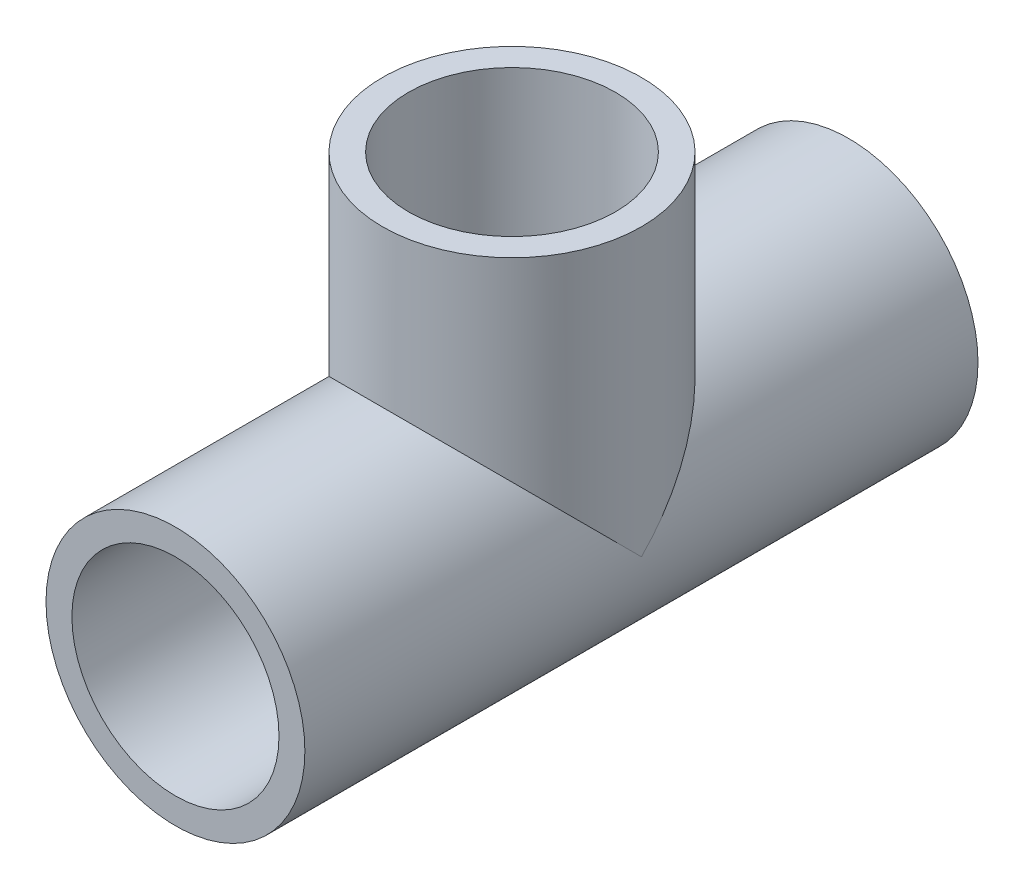
ISO-10303-21;
HEADER;
FILE_DESCRIPTION(('STEP AP214'),'2;1');
FILE_NAME('part.step','',(''),(''),'','','');
FILE_SCHEMA(('AUTOMOTIVE_DESIGN { 1 0 10303 214 1 1 1 1 }'));
ENDSEC;
DATA;
#1=APPLICATION_CONTEXT('core data for automotive mechanical design processes');
#2=APPLICATION_PROTOCOL_DEFINITION('international standard','automotive_design',2000,#1);
#3=PRODUCT_CONTEXT('',#1,'mechanical');
#4=PRODUCT('Part','Part','',(#3));
#5=PRODUCT_RELATED_PRODUCT_CATEGORY('part','',(#4));
#6=PRODUCT_DEFINITION_FORMATION('','',#4);
#7=PRODUCT_DEFINITION_CONTEXT('part definition',#1,'design');
#8=PRODUCT_DEFINITION('design','',#6,#7);
#9=PRODUCT_DEFINITION_SHAPE('','',#8);
#10=(LENGTH_UNIT() NAMED_UNIT(*) SI_UNIT(.MILLI.,.METRE.));
#11=(NAMED_UNIT(*) PLANE_ANGLE_UNIT() SI_UNIT($,.RADIAN.));
#12=(NAMED_UNIT(*) SI_UNIT($,.STERADIAN.) SOLID_ANGLE_UNIT());
#13=UNCERTAINTY_MEASURE_WITH_UNIT(LENGTH_MEASURE(1.E-05),#10,'distance_accuracy_value','');
#14=(GEOMETRIC_REPRESENTATION_CONTEXT(3) GLOBAL_UNCERTAINTY_ASSIGNED_CONTEXT((#13)) GLOBAL_UNIT_ASSIGNED_CONTEXT((#10,
#11,#12)) REPRESENTATION_CONTEXT('',''));
#15=CARTESIAN_POINT('',(0.,0.,0.));
#16=DIRECTION('',(0.,0.,1.));
#17=DIRECTION('',(1.,0.,0.));
#18=AXIS2_PLACEMENT_3D('',#15,#16,#17);
#19=CARTESIAN_POINT('',(0.,0.,82.55));
#20=DIRECTION('',(0.,0.,-1.));
#21=DIRECTION('',(-1.,0.,0.));
#22=AXIS2_PLACEMENT_3D('',#19,#20,#21);
#23=CYLINDRICAL_SURFACE('',#22,15.875);
#24=CARTESIAN_POINT('',(0.,0.,0.));
#25=DIRECTION('',(0.,0.,1.));
#26=DIRECTION('',(1.,0.,0.));
#27=AXIS2_PLACEMENT_3D('',#24,#25,#26);
#28=CIRCLE('',#27,15.875);
#29=CARTESIAN_POINT('',(15.875,0.,0.));
#30=VERTEX_POINT('',#29);
#31=EDGE_CURVE('E120',#30,#30,#28,.T.);
#32=ORIENTED_EDGE('',*,*,#31,.T.);
#33=EDGE_LOOP('',(#32));
#34=FACE_BOUND('',#33,.T.);
#35=CARTESIAN_POINT('',(0.,0.,82.55));
#36=DIRECTION('',(0.,0.,1.));
#37=DIRECTION('',(1.,0.,0.));
#38=AXIS2_PLACEMENT_3D('',#35,#36,#37);
#39=CIRCLE('',#38,15.875);
#40=CARTESIAN_POINT('',(15.875,0.,82.55));
#41=VERTEX_POINT('',#40);
#42=EDGE_CURVE('E123',#41,#41,#39,.T.);
#43=ORIENTED_EDGE('',*,*,#42,.F.);
#44=EDGE_LOOP('',(#43));
#45=FACE_BOUND('',#44,.T.);
#46=CARTESIAN_POINT('',(0.,0.,41.275));
#47=DIRECTION('',(0.,-0.707106781186547,-0.707106781186547));
#48=DIRECTION('',(0.,0.707106781186547,-0.707106781186547));
#49=AXIS2_PLACEMENT_3D('',#46,#47,#48);
#50=ELLIPSE('',#49,22.4506403026729,15.875);
#51=CARTESIAN_POINT('',(15.875,0.,41.275));
#52=VERTEX_POINT('',#51);
#53=CARTESIAN_POINT('',(-15.875,0.,41.275));
#54=VERTEX_POINT('',#53);
#55=EDGE_CURVE('E99',#52,#54,#50,.F.);
#56=ORIENTED_EDGE('',*,*,#55,.F.);
#57=CARTESIAN_POINT('',(0.,0.,41.275));
#58=DIRECTION('',(0.,0.707106781186547,-0.707106781186547));
#59=DIRECTION('',(0.,-0.707106781186547,-0.707106781186547));
#60=AXIS2_PLACEMENT_3D('',#57,#58,#59);
#61=ELLIPSE('',#60,22.4506403026729,15.875);
#62=EDGE_CURVE('E101',#54,#52,#61,.T.);
#63=ORIENTED_EDGE('',*,*,#62,.F.);
#64=EDGE_LOOP('',(#56,#63));
#65=FACE_BOUND('',#64,.T.);
#66=ADVANCED_FACE('F50',(#34,#45,#65),#23,.T.);
#67=CARTESIAN_POINT('',(0.,0.,82.55));
#68=DIRECTION('',(0.,0.,-1.));
#69=DIRECTION('',(-1.,0.,0.));
#70=AXIS2_PLACEMENT_3D('',#67,#68,#69);
#71=CYLINDRICAL_SURFACE('',#70,12.7);
#72=CARTESIAN_POINT('',(0.,0.,82.55));
#73=DIRECTION('',(0.,0.,1.));
#74=DIRECTION('',(1.,0.,0.));
#75=AXIS2_PLACEMENT_3D('',#72,#73,#74);
#76=CIRCLE('',#75,12.7);
#77=CARTESIAN_POINT('',(12.7,0.,82.55));
#78=VERTEX_POINT('',#77);
#79=EDGE_CURVE('E117',#78,#78,#76,.T.);
#80=ORIENTED_EDGE('',*,*,#79,.T.);
#81=EDGE_LOOP('',(#80));
#82=FACE_BOUND('',#81,.T.);
#83=CARTESIAN_POINT('',(0.,0.,0.));
#84=DIRECTION('',(0.,0.,1.));
#85=DIRECTION('',(1.,0.,0.));
#86=AXIS2_PLACEMENT_3D('',#83,#84,#85);
#87=CIRCLE('',#86,12.7);
#88=CARTESIAN_POINT('',(12.7,0.,0.));
#89=VERTEX_POINT('',#88);
#90=EDGE_CURVE('E103',#89,#89,#87,.T.);
#91=ORIENTED_EDGE('',*,*,#90,.F.);
#92=EDGE_LOOP('',(#91));
#93=FACE_BOUND('',#92,.T.);
#94=CARTESIAN_POINT('',(-12.7,0.,50.8));
#95=CARTESIAN_POINT('',(-12.7000020190157,0.120457220435205,50.7999931454954));
#96=CARTESIAN_POINT('',(-12.6982857352557,0.240895788005528,50.8022861414985));
#97=CARTESIAN_POINT('',(-12.6914397273617,0.481489797911837,50.8114055510163));
#98=CARTESIAN_POINT('',(-12.6863104164843,0.601645272757896,50.8182314156814));
#99=CARTESIAN_POINT('',(-12.6658631565599,0.960903594842883,50.8453751065335));
#100=CARTESIAN_POINT('',(-12.6454856875881,1.19926075909517,50.8723595407881));
#101=CARTESIAN_POINT('',(-12.5920686632285,1.668815092919,50.9423322951937));
#102=CARTESIAN_POINT('',(-12.5592011476064,1.90006532924779,50.9851029530953));
#103=CARTESIAN_POINT('',(-12.4814300280908,2.35749152288866,51.0848686225589));
#104=CARTESIAN_POINT('',(-12.4365204697211,2.58366490970915,51.1418706702085));
#105=CARTESIAN_POINT('',(-12.3173310297827,3.10962041541669,51.2905375413906));
#106=CARTESIAN_POINT('',(-12.2382888563161,3.40688031881205,51.3873138385871));
#107=CARTESIAN_POINT('',(-12.0610266921361,3.98928517069466,51.5980908287854));
#108=CARTESIAN_POINT('',(-11.962800007982,4.27442584840571,51.7120975302947));
#109=CARTESIAN_POINT('',(-11.7477751382529,4.83428594393877,51.953563183024));
#110=CARTESIAN_POINT('',(-11.6308527238877,5.10891924337498,52.0811100525965));
#111=CARTESIAN_POINT('',(-11.3799378103041,5.64577828806145,52.3450417799175));
#112=CARTESIAN_POINT('',(-11.2459453268863,5.90800404479628,52.4814266294851));
#113=CARTESIAN_POINT('',(-10.9104442592845,6.51236278518281,52.8097686284099));
#114=CARTESIAN_POINT('',(-10.7019724899368,6.8493638559431,53.0040899488695));
#115=CARTESIAN_POINT('',(-10.2556318152206,7.50120483732141,53.3963046383713));
#116=CARTESIAN_POINT('',(-10.017752559318,7.81603688357521,53.594199244053));
#117=CARTESIAN_POINT('',(-9.5135542224541,8.42243767618516,53.9875916560546));
#118=CARTESIAN_POINT('',(-9.24728910518505,8.71404878585583,54.1830932495118));
#119=CARTESIAN_POINT('',(-8.68626366942597,9.27338251857499,54.5671011182128));
#120=CARTESIAN_POINT('',(-8.39151287342887,9.5411130675123,54.7556097021919));
#121=CARTESIAN_POINT('',(-7.83471296182659,10.0005303734981,55.0849944484669));
#122=CARTESIAN_POINT('',(-7.57766317222003,10.1968064943824,55.2279375464021));
#123=CARTESIAN_POINT('',(-7.04575636494124,10.5713325906151,55.5039378534761));
#124=CARTESIAN_POINT('',(-6.77090280202105,10.7495860461013,55.6369969698687));
#125=CARTESIAN_POINT('',(-6.20426323145577,11.0862804703238,55.8907111260984));
#126=CARTESIAN_POINT('',(-5.91249447453126,11.2447411216155,56.0113784670992));
#127=CARTESIAN_POINT('',(-5.31280610339242,11.5401799218051,56.2380344387988));
#128=CARTESIAN_POINT('',(-5.00488918163112,11.6771616368777,56.3440255058754));
#129=CARTESIAN_POINT('',(-4.425454327537,11.9074015999695,56.5231966189983));
#130=CARTESIAN_POINT('',(-4.15610262527791,12.0041482787503,56.5989108500035));
#131=CARTESIAN_POINT('',(-3.60839818535308,12.1799896462339,56.737044181086));
#132=CARTESIAN_POINT('',(-3.33004717495028,12.25908769953,56.7994658152049));
#133=CARTESIAN_POINT('',(-2.7659666255489,12.3985402440061,56.9098203734429));
#134=CARTESIAN_POINT('',(-2.48023980257047,12.4589015309843,56.9577585505223));
#135=CARTESIAN_POINT('',(-1.90317254586771,12.5600052433626,57.0381982036217));
#136=CARTESIAN_POINT('',(-1.61183204512453,12.6007474343893,57.0706994952296));
#137=CARTESIAN_POINT('',(-1.02463973992323,12.6620516496277,57.1196468610908));
#138=CARTESIAN_POINT('',(-0.728775648667192,12.6825419946809,57.1360359067607));
#139=CARTESIAN_POINT('',(-0.135881418732538,12.7027365768809,57.152188179596));
#140=CARTESIAN_POINT('',(0.161148722203146,12.7024407737731,57.1519513745636));
#141=CARTESIAN_POINT('',(0.753983080884214,12.6810683175266,57.1348574409421));
#142=CARTESIAN_POINT('',(1.04978726417212,12.6599910842175,57.1179998483384));
#143=CARTESIAN_POINT('',(1.63782707746529,12.5974183069038,57.0680433484764));
#144=CARTESIAN_POINT('',(1.93006278970111,12.5559232343137,57.0349448161952));
#145=CARTESIAN_POINT('',(2.49298526407243,12.4560119480922,56.9554654582464));
#146=CARTESIAN_POINT('',(2.76397670252361,12.398644768262,56.9099096489025));
#147=CARTESIAN_POINT('',(3.29925463569688,12.2670647439164,56.8057722101418));
#148=CARTESIAN_POINT('',(3.56354143094871,12.1928526559477,56.7471911657231));
#149=CARTESIAN_POINT('',(4.08408475397729,12.0284977139538,56.6180049838499));
#150=CARTESIAN_POINT('',(4.34034108460205,11.9383544691707,56.5473995514639));
#151=CARTESIAN_POINT('',(4.84382830000625,11.7430946573799,56.3952563498196));
#152=CARTESIAN_POINT('',(5.09105583872274,11.6379726085835,56.313714578837));
#153=CARTESIAN_POINT('',(5.59883053806604,11.4030123069785,56.1325968673822));
#154=CARTESIAN_POINT('',(5.85837800253528,11.2717701125642,56.0320411404156));
#155=CARTESIAN_POINT('',(6.36482411771553,10.9937487440949,55.820788585645));
#156=CARTESIAN_POINT('',(6.61171748199104,10.8469631538188,55.7100875724841));
#157=CARTESIAN_POINT('',(7.09220268925761,10.5390736913699,55.480182538092));
#158=CARTESIAN_POINT('',(7.32579555165088,10.3779709189517,55.3609791700961));
#159=CARTESIAN_POINT('',(7.77939052320562,10.0424442004444,55.1156363364121));
#160=CARTESIAN_POINT('',(7.99939079463111,9.86801846017075,54.9894959371669));
#161=CARTESIAN_POINT('',(8.46939468078702,9.46957201797172,54.7053786487767));
#162=CARTESIAN_POINT('',(8.71627304612124,9.24272569277797,54.5461863909592));
#163=CARTESIAN_POINT('',(9.18978908245435,8.77207208731955,54.2228036554457));
#164=CARTESIAN_POINT('',(9.41642348756533,8.52826208160886,54.0586123769832));
#165=CARTESIAN_POINT('',(9.84977434967008,8.02388646518769,53.7277923040782));
#166=CARTESIAN_POINT('',(10.0564439020229,7.76328368506854,53.5611587803954));
#167=CARTESIAN_POINT('',(10.4490338991801,7.22622531781981,53.2290532683469));
#168=CARTESIAN_POINT('',(10.6349564200409,6.94977132104437,53.0635811653188));
#169=CARTESIAN_POINT('',(10.9690108303573,6.40798311488343,52.7529530167784));
#170=CARTESIAN_POINT('',(11.1190543740456,6.14407917974281,52.6073580938658));
#171=CARTESIAN_POINT('',(11.4012569330629,5.60307275730977,52.323394320562));
#172=CARTESIAN_POINT('',(11.5334152617068,5.32596976380453,52.1850257477445));
#173=CARTESIAN_POINT('',(11.7781790910878,4.76013813484762,51.9203000453653));
#174=CARTESIAN_POINT('',(11.8909029312577,4.47149407907539,51.793872504843));
#175=CARTESIAN_POINT('',(12.0965405286296,3.88090415582699,51.5567298003032));
#176=CARTESIAN_POINT('',(12.1894571675912,3.57896023107917,51.4460123514014));
#177=CARTESIAN_POINT('',(12.3399831426476,3.0141756677338,51.2625966688289));
#178=CARTESIAN_POINT('',(12.4009014733096,2.75328540939466,51.1866361270515));
#179=CARTESIAN_POINT('',(12.5066887284913,2.2238573851786,51.0528141018951));
#180=CARTESIAN_POINT('',(12.5515693117192,1.95532532848868,50.9949394747406));
#181=CARTESIAN_POINT('',(12.624794753091,1.40781429219366,50.899651381169));
#182=CARTESIAN_POINT('',(12.6528653194416,1.12873709118321,50.8625779126398));
#183=CARTESIAN_POINT('',(12.6810763153038,0.707285081145894,50.8251909201515));
#184=CARTESIAN_POINT('',(12.6881643195889,0.566114288796244,50.815765402523));
#185=CARTESIAN_POINT('',(12.6976286615385,0.283305940912668,50.8031625895083));
#186=CARTESIAN_POINT('',(12.7000039484373,0.141668288335549,50.7999866875617));
#187=CARTESIAN_POINT('',(12.7,0.,50.8));
#188=B_SPLINE_CURVE_WITH_KNOTS('',3,(#94,#95,#96,#97,#98,#99,#100,#101,#102,#103,#104,#105,#106,
#107,#108,#109,#110,#111,#112,#113,#114,#115,#116,#117,#118,#119,#120,#121,#122,#123,#124,#125,
#126,#127,#128,#129,#130,#131,#132,#133,#134,#135,#136,#137,#138,#139,#140,#141,#142,#143,#144,
#145,#146,#147,#148,#149,#150,#151,#152,#153,#154,#155,#156,#157,#158,#159,#160,#161,#162,#163,
#164,#165,#166,#167,#168,#169,#170,#171,#172,#173,#174,#175,#176,#177,#178,#179,#180,#181,#182,
#183,#184,#185,#186,#187),.UNSPECIFIED.,.F.,.F.,(4,2,2,2,2,2,2,2,2,2,2,2,2,2,2,2,2,2,2,2,2,2,2,
2,2,2,2,2,2,2,2,2,2,2,2,2,2,2,2,2,2,2,2,2,2,2,4),(0.,0.361301476907899,0.722559214629676,
1.44369299400324,2.15523408594504,2.86712766730382,3.83296427039091,4.79913845602985,
5.77202201856992,6.74490468057964,8.0672558075375,9.3900736938217,10.7104201937835,
12.0303268311687,13.0901711530386,14.1498104288348,15.208387433519,16.2667884948094,
17.1540314178097,18.0411050490388,18.9278565629822,19.814618669968,20.7045082520937,
21.5943995575846,22.4843157075249,23.3742113117129,24.2154590529315,25.0566690190935,
25.897899621236,26.7394388828266,27.6617642097324,28.5844717622825,29.5071084994776,
30.4298697066144,31.5422624652717,32.6548343594968,33.7699595669859,34.8849730889605,
35.8942853011375,36.9036362538669,37.9066056091179,38.9094289421084,39.7438154854878,
40.5775942281515,41.4246313294816,41.8494273378407,42.2743180497123),.UNSPECIFIED.);
#189=CARTESIAN_POINT('',(-12.7,0.,50.8));
#190=VERTEX_POINT('',#189);
#191=CARTESIAN_POINT('',(12.7,0.,50.8));
#192=VERTEX_POINT('',#191);
#193=EDGE_CURVE('E134',#190,#192,#188,.T.);
#194=ORIENTED_EDGE('',*,*,#193,.T.);
#195=DIRECTION('',(0.,0.,-1.));
#196=VECTOR('',#195,1.);
#197=CARTESIAN_POINT('',(12.7,0.,82.55));
#198=LINE('',#197,#196);
#199=CARTESIAN_POINT('',(12.7,0.,41.275));
#200=VERTEX_POINT('',#199);
#201=EDGE_CURVE('E14',#192,#200,#198,.T.);
#202=ORIENTED_EDGE('',*,*,#201,.T.);
#203=CARTESIAN_POINT('',(12.7,0.,31.75));
#204=VERTEX_POINT('',#203);
#205=EDGE_CURVE('E68',#200,#204,#198,.T.);
#206=ORIENTED_EDGE('',*,*,#205,.T.);
#207=CARTESIAN_POINT('',(12.7,0.,31.75));
#208=CARTESIAN_POINT('',(12.7000020190157,0.120457220435206,31.7500068545046));
#209=CARTESIAN_POINT('',(12.6982857352557,0.240895788005528,31.7477138585015));
#210=CARTESIAN_POINT('',(12.6914397273617,0.481489797911838,31.7385944489837));
#211=CARTESIAN_POINT('',(12.6863104164843,0.601645272757896,31.7317685843186));
#212=CARTESIAN_POINT('',(12.6658631565599,0.960903594842884,31.7046248934665));
#213=CARTESIAN_POINT('',(12.6454856875881,1.19926075909517,31.6776404592118));
#214=CARTESIAN_POINT('',(12.5920686632285,1.668815092919,31.6076677048063));
#215=CARTESIAN_POINT('',(12.5592011476064,1.90006532924779,31.5648970469047));
#216=CARTESIAN_POINT('',(12.4814300280908,2.35749152288867,31.4651313774411));
#217=CARTESIAN_POINT('',(12.4365204697211,2.58366490970916,31.4081293297915));
#218=CARTESIAN_POINT('',(12.3173310297827,3.1096204154167,31.2594624586094));
#219=CARTESIAN_POINT('',(12.2382888563161,3.40688031881206,31.1626861614129));
#220=CARTESIAN_POINT('',(12.0610266921361,3.98928517069467,30.9519091712146));
#221=CARTESIAN_POINT('',(11.962800007982,4.27442584840571,30.8379024697053));
#222=CARTESIAN_POINT('',(11.7477751382529,4.83428594393878,30.596436816976));
#223=CARTESIAN_POINT('',(11.6308527238877,5.10891924337499,30.4688899474035));
#224=CARTESIAN_POINT('',(11.3799378103041,5.64577828806146,30.2049582200825));
#225=CARTESIAN_POINT('',(11.2459453268863,5.90800404479629,30.0685733705148));
#226=CARTESIAN_POINT('',(10.9104442592845,6.51236278518281,29.7402313715901));
#227=CARTESIAN_POINT('',(10.7019724899368,6.84936385594311,29.5459100511305));
#228=CARTESIAN_POINT('',(10.2556318152206,7.50120483732141,29.1536953616287));
#229=CARTESIAN_POINT('',(10.017752559318,7.81603688357521,28.955800755947));
#230=CARTESIAN_POINT('',(9.5135542224541,8.42243767618517,28.5624083439454));
#231=CARTESIAN_POINT('',(9.24728910518504,8.71404878585585,28.3669067504882));
#232=CARTESIAN_POINT('',(8.68626366942595,9.273382518575,27.9828988817872));
#233=CARTESIAN_POINT('',(8.39151287342886,9.5411130675123,27.7943902978081));
#234=CARTESIAN_POINT('',(7.83471296182658,10.0005303734981,27.4650055515331));
#235=CARTESIAN_POINT('',(7.57766317222003,10.1968064943824,27.3220624535979));
#236=CARTESIAN_POINT('',(7.04575636494123,10.5713325906151,27.0460621465239));
#237=CARTESIAN_POINT('',(6.77090280202104,10.7495860461013,26.9130030301312));
#238=CARTESIAN_POINT('',(6.20426323145576,11.0862804703238,26.6592888739016));
#239=CARTESIAN_POINT('',(5.91249447453125,11.2447411216155,26.5386215329008));
#240=CARTESIAN_POINT('',(5.31280610339241,11.5401799218051,26.3119655612012));
#241=CARTESIAN_POINT('',(5.00488918163112,11.6771616368777,26.2059744941246));
#242=CARTESIAN_POINT('',(4.42545432753699,11.9074015999695,26.0268033810017));
#243=CARTESIAN_POINT('',(4.1561026252779,12.0041482787503,25.9510891499965));
#244=CARTESIAN_POINT('',(3.60839818535307,12.1799896462339,25.812955818914));
#245=CARTESIAN_POINT('',(3.33004717495028,12.25908769953,25.750534184795));
#246=CARTESIAN_POINT('',(2.76596662554889,12.3985402440061,25.6401796265571));
#247=CARTESIAN_POINT('',(2.48023980257047,12.4589015309843,25.5922414494777));
#248=CARTESIAN_POINT('',(1.9031725458677,12.5600052433626,25.5118017963783));
#249=CARTESIAN_POINT('',(1.61183204512452,12.6007474343893,25.4793005047704));
#250=CARTESIAN_POINT('',(1.02463973992322,12.6620516496277,25.4303531389092));
#251=CARTESIAN_POINT('',(0.728775648667189,12.6825419946809,25.4139640932393));
#252=CARTESIAN_POINT('',(0.135881418732536,12.7027365768809,25.397811820404));
#253=CARTESIAN_POINT('',(-0.161148722203146,12.7024407737731,25.3980486254364));
#254=CARTESIAN_POINT('',(-0.753983080884213,12.6810683175266,25.4151425590579));
#255=CARTESIAN_POINT('',(-1.04978726417212,12.6599910842175,25.4320001516616));
#256=CARTESIAN_POINT('',(-1.63782707746529,12.5974183069038,25.4819566515236));
#257=CARTESIAN_POINT('',(-1.93006278970111,12.5559232343137,25.5150551838048));
#258=CARTESIAN_POINT('',(-2.49298526407243,12.4560119480922,25.5945345417536));
#259=CARTESIAN_POINT('',(-2.7639767025236,12.398644768262,25.6400903510975));
#260=CARTESIAN_POINT('',(-3.29925463569687,12.2670647439164,25.7442277898582));
#261=CARTESIAN_POINT('',(-3.5635414309487,12.1928526559477,25.8028088342769));
#262=CARTESIAN_POINT('',(-4.08408475397729,12.0284977139538,25.9319950161501));
#263=CARTESIAN_POINT('',(-4.34034108460204,11.9383544691707,26.0026004485361));
#264=CARTESIAN_POINT('',(-4.84382830000624,11.7430946573799,26.1547436501804));
#265=CARTESIAN_POINT('',(-5.09105583872274,11.6379726085835,26.236285421163));
#266=CARTESIAN_POINT('',(-5.59883053806603,11.4030123069785,26.4174031326178));
#267=CARTESIAN_POINT('',(-5.85837800253528,11.2717701125642,26.5179588595844));
#268=CARTESIAN_POINT('',(-6.36482411771552,10.9937487440949,26.729211414355));
#269=CARTESIAN_POINT('',(-6.61171748199103,10.8469631538188,26.8399124275159));
#270=CARTESIAN_POINT('',(-7.09220268925761,10.5390736913699,27.069817461908));
#271=CARTESIAN_POINT('',(-7.32579555165088,10.3779709189517,27.1890208299039));
#272=CARTESIAN_POINT('',(-7.77939052320561,10.0424442004444,27.4343636635879));
#273=CARTESIAN_POINT('',(-7.99939079463111,9.86801846017075,27.5605040628331));
#274=CARTESIAN_POINT('',(-8.46939468078702,9.46957201797173,27.8446213512233));
#275=CARTESIAN_POINT('',(-8.71627304612124,9.24272569277797,28.0038136090408));
#276=CARTESIAN_POINT('',(-9.18978908245435,8.77207208731954,28.3271963445543));
#277=CARTESIAN_POINT('',(-9.41642348756533,8.52826208160885,28.4913876230168));
#278=CARTESIAN_POINT('',(-9.84977434967008,8.02388646518769,28.8222076959219));
#279=CARTESIAN_POINT('',(-10.0564439020229,7.76328368506853,28.9888412196046));
#280=CARTESIAN_POINT('',(-10.4490338991801,7.22622531781981,29.3209467316531));
#281=CARTESIAN_POINT('',(-10.6349564200409,6.94977132104437,29.4864188346812));
#282=CARTESIAN_POINT('',(-10.9690108303573,6.40798311488343,29.7970469832216));
#283=CARTESIAN_POINT('',(-11.1190543740456,6.14407917974281,29.9426419061342));
#284=CARTESIAN_POINT('',(-11.4012569330629,5.60307275730977,30.226605679438));
#285=CARTESIAN_POINT('',(-11.5334152617068,5.32596976380453,30.3649742522555));
#286=CARTESIAN_POINT('',(-11.7781790910878,4.76013813484762,30.6296999546347));
#287=CARTESIAN_POINT('',(-11.8909029312577,4.47149407907539,30.756127495157));
#288=CARTESIAN_POINT('',(-12.0965405286296,3.88090415582699,30.9932701996968));
#289=CARTESIAN_POINT('',(-12.1894571675912,3.57896023107917,31.1039876485986));
#290=CARTESIAN_POINT('',(-12.3399831426476,3.01417566773381,31.2874033311711));
#291=CARTESIAN_POINT('',(-12.4009014733096,2.75328540939466,31.3633638729485));
#292=CARTESIAN_POINT('',(-12.5066887284913,2.2238573851786,31.4971858981049));
#293=CARTESIAN_POINT('',(-12.5515693117192,1.95532532848868,31.5550605252594));
#294=CARTESIAN_POINT('',(-12.624794753091,1.40781429219365,31.650348618831));
#295=CARTESIAN_POINT('',(-12.6528653194416,1.12873709118321,31.6874220873602));
#296=CARTESIAN_POINT('',(-12.6810763153038,0.707285081145895,31.7248090798485));
#297=CARTESIAN_POINT('',(-12.6881643195889,0.566114288796245,31.734234597477));
#298=CARTESIAN_POINT('',(-12.6976286615385,0.283305940912669,31.7468374104917));
#299=CARTESIAN_POINT('',(-12.7000039484373,0.141668288335548,31.7500133124383));
#300=CARTESIAN_POINT('',(-12.7,0.,31.75));
#301=B_SPLINE_CURVE_WITH_KNOTS('',3,(#207,#208,#209,#210,#211,#212,#213,#214,#215,#216,#217,
#218,#219,#220,#221,#222,#223,#224,#225,#226,#227,#228,#229,#230,#231,#232,#233,#234,#235,#236,
#237,#238,#239,#240,#241,#242,#243,#244,#245,#246,#247,#248,#249,#250,#251,#252,#253,#254,#255,
#256,#257,#258,#259,#260,#261,#262,#263,#264,#265,#266,#267,#268,#269,#270,#271,#272,#273,#274,
#275,#276,#277,#278,#279,#280,#281,#282,#283,#284,#285,#286,#287,#288,#289,#290,#291,#292,#293,
#294,#295,#296,#297,#298,#299,#300),.UNSPECIFIED.,.F.,.F.,(4,2,2,2,2,2,2,2,2,2,2,2,2,2,2,2,2,2,
2,2,2,2,2,2,2,2,2,2,2,2,2,2,2,2,2,2,2,2,2,2,2,2,2,2,2,2,4),(0.,0.3613014769079,
0.722559214629677,1.44369299400324,2.15523408594505,2.86712766730382,3.83296427039091,
4.79913845602986,5.77202201856993,6.74490468057965,8.0672558075375,9.39007369382171,
10.7104201937835,12.0303268311687,13.0901711530386,14.1498104288348,15.208387433519,
16.2667884948094,17.1540314178097,18.0411050490388,18.9278565629822,19.814618669968,
20.7045082520937,21.5943995575846,22.4843157075249,23.3742113117129,24.2154590529315,
25.0566690190935,25.897899621236,26.7394388828266,27.6617642097323,28.5844717622825,
29.5071084994776,30.4298697066144,31.5422624652717,32.6548343594968,33.7699595669859,
34.8849730889605,35.8942853011375,36.9036362538669,37.9066056091179,38.9094289421084,
39.7438154854878,40.5775942281515,41.4246313294817,41.8494273378407,42.2743180497123),.UNSPECIFIED.);
#302=CARTESIAN_POINT('',(-12.7,0.,31.75));
#303=VERTEX_POINT('',#302);
#304=EDGE_CURVE('E55',#204,#303,#301,.T.);
#305=ORIENTED_EDGE('',*,*,#304,.T.);
#306=DIRECTION('',(0.,0.,-1.));
#307=VECTOR('',#306,1.);
#308=CARTESIAN_POINT('',(-12.7,0.,82.55));
#309=LINE('',#308,#307);
#310=CARTESIAN_POINT('',(-12.7,0.,41.275));
#311=VERTEX_POINT('',#310);
#312=EDGE_CURVE('E66',#303,#311,#309,.F.);
#313=ORIENTED_EDGE('',*,*,#312,.T.);
#314=EDGE_CURVE('E133',#311,#190,#309,.F.);
#315=ORIENTED_EDGE('',*,*,#314,.T.);
#316=EDGE_LOOP('',(#194,#202,#206,#305,#313,#315));
#317=FACE_BOUND('',#316,.T.);
#318=ADVANCED_FACE('F173',(#82,#93,#317),#71,.F.);
#319=CARTESIAN_POINT('',(0.,0.,82.55));
#320=DIRECTION('',(0.,0.,1.));
#321=DIRECTION('',(1.,0.,0.));
#322=AXIS2_PLACEMENT_3D('',#319,#320,#321);
#323=PLANE('',#322);
#324=ORIENTED_EDGE('',*,*,#42,.T.);
#325=EDGE_LOOP('',(#324));
#326=FACE_BOUND('',#325,.T.);
#327=ORIENTED_EDGE('',*,*,#79,.F.);
#328=EDGE_LOOP('',(#327));
#329=FACE_BOUND('',#328,.T.);
#330=ADVANCED_FACE('F166',(#326,#329),#323,.T.);
#331=CARTESIAN_POINT('',(0.,0.,0.));
#332=DIRECTION('',(0.,0.,1.));
#333=DIRECTION('',(1.,0.,0.));
#334=AXIS2_PLACEMENT_3D('',#331,#332,#333);
#335=PLANE('',#334);
#336=ORIENTED_EDGE('',*,*,#31,.F.);
#337=EDGE_LOOP('',(#336));
#338=FACE_BOUND('',#337,.T.);
#339=ORIENTED_EDGE('',*,*,#90,.T.);
#340=EDGE_LOOP('',(#339));
#341=FACE_BOUND('',#340,.T.);
#342=ADVANCED_FACE('F162',(#338,#341),#335,.F.);
#343=CARTESIAN_POINT('',(0.,35.052,41.275));
#344=DIRECTION('',(0.,-1.,0.));
#345=DIRECTION('',(0.,0.,-1.));
#346=AXIS2_PLACEMENT_3D('',#343,#344,#345);
#347=CYLINDRICAL_SURFACE('',#346,12.7);
#348=CARTESIAN_POINT('',(0.,0.,41.275));
#349=DIRECTION('',(0.,1.,0.));
#350=DIRECTION('',(0.,0.,1.));
#351=AXIS2_PLACEMENT_3D('',#348,#349,#350);
#352=CIRCLE('',#351,12.7);
#353=EDGE_CURVE('E80',#311,#200,#352,.T.);
#354=ORIENTED_EDGE('',*,*,#353,.F.);
#355=CARTESIAN_POINT('',(0.,0.,41.275));
#356=DIRECTION('',(0.,0.707106781186547,-0.707106781186547));
#357=DIRECTION('',(0.,-0.707106781186547,-0.707106781186547));
#358=AXIS2_PLACEMENT_3D('',#355,#356,#357);
#359=ELLIPSE('',#358,17.9605122421383,12.7);
#360=EDGE_CURVE('E126',#311,#200,#359,.T.);
#361=ORIENTED_EDGE('',*,*,#360,.T.);
#362=EDGE_LOOP('',(#354,#361));
#363=FACE_BOUND('',#362,.T.);
#364=ADVANCED_FACE('F147',(#363),#347,.F.);
#365=CARTESIAN_POINT('',(0.,35.052,41.275));
#366=DIRECTION('',(0.,-1.,0.));
#367=DIRECTION('',(0.,0.,-1.));
#368=AXIS2_PLACEMENT_3D('',#365,#366,#367);
#369=CYLINDRICAL_SURFACE('',#368,15.875);
#370=ORIENTED_EDGE('',*,*,#193,.F.);
#371=CARTESIAN_POINT('',(0.,0.,41.275));
#372=DIRECTION('',(0.,1.,0.));
#373=DIRECTION('',(0.,0.,1.));
#374=AXIS2_PLACEMENT_3D('',#371,#372,#373);
#375=CIRCLE('',#374,15.875);
#376=EDGE_CURVE('E271',#190,#192,#375,.T.);
#377=ORIENTED_EDGE('',*,*,#376,.T.);
#378=EDGE_LOOP('',(#370,#377));
#379=FACE_BOUND('',#378,.T.);
#380=ADVANCED_FACE('F142',(#379),#369,.T.);
#381=CARTESIAN_POINT('',(0.,0.,41.275));
#382=DIRECTION('',(0.,1.,0.));
#383=DIRECTION('',(0.,0.,1.));
#384=AXIS2_PLACEMENT_3D('',#381,#382,#383);
#385=PLANE('',#384);
#386=ORIENTED_EDGE('',*,*,#201,.F.);
#387=ORIENTED_EDGE('',*,*,#376,.F.);
#388=ORIENTED_EDGE('',*,*,#314,.F.);
#389=ORIENTED_EDGE('',*,*,#353,.T.);
#390=EDGE_LOOP('',(#386,#387,#388,#389));
#391=FACE_BOUND('',#390,.T.);
#392=ADVANCED_FACE('F146',(#391),#385,.F.);
#393=CARTESIAN_POINT('',(0.,0.,41.275));
#394=DIRECTION('',(0.,-0.707106781186547,-0.707106781186547));
#395=DIRECTION('',(0.,0.707106781186547,-0.707106781186547));
#396=AXIS2_PLACEMENT_3D('',#393,#394,#395);
#397=ELLIPSE('',#396,17.9605122421383,12.7);
#398=EDGE_CURVE('E130',#200,#311,#397,.F.);
#399=ORIENTED_EDGE('',*,*,#398,.F.);
#400=ORIENTED_EDGE('',*,*,#360,.F.);
#401=EDGE_LOOP('',(#399,#400));
#402=FACE_BOUND('',#401,.T.);
#403=ADVANCED_FACE('F139',(#402),#71,.F.);
#404=ORIENTED_EDGE('',*,*,#304,.F.);
#405=EDGE_CURVE('E273',#204,#303,#375,.T.);
#406=ORIENTED_EDGE('',*,*,#405,.T.);
#407=EDGE_LOOP('',(#404,#406));
#408=FACE_BOUND('',#407,.T.);
#409=ADVANCED_FACE('F149',(#408),#369,.T.);
#410=EDGE_CURVE('E277',#200,#311,#352,.T.);
#411=ORIENTED_EDGE('',*,*,#410,.F.);
#412=ORIENTED_EDGE('',*,*,#398,.T.);
#413=EDGE_LOOP('',(#411,#412));
#414=FACE_BOUND('',#413,.T.);
#415=ADVANCED_FACE('F154',(#414),#347,.F.);
#416=ORIENTED_EDGE('',*,*,#205,.F.);
#417=ORIENTED_EDGE('',*,*,#410,.T.);
#418=ORIENTED_EDGE('',*,*,#312,.F.);
#419=ORIENTED_EDGE('',*,*,#405,.F.);
#420=EDGE_LOOP('',(#416,#417,#418,#419));
#421=FACE_BOUND('',#420,.T.);
#422=ADVANCED_FACE('F150',(#421),#385,.F.);
#423=CARTESIAN_POINT('',(0.,35.052,41.275));
#424=DIRECTION('',(0.,1.,0.));
#425=DIRECTION('',(0.,0.,1.));
#426=AXIS2_PLACEMENT_3D('',#423,#424,#425);
#427=CIRCLE('',#426,15.875);
#428=CARTESIAN_POINT('',(0.,35.052,57.15));
#429=VERTEX_POINT('',#428);
#430=EDGE_CURVE('E109',#429,#429,#427,.T.);
#431=ORIENTED_EDGE('',*,*,#430,.F.);
#432=EDGE_LOOP('',(#431));
#433=FACE_BOUND('',#432,.T.);
#434=ORIENTED_EDGE('',*,*,#62,.T.);
#435=ORIENTED_EDGE('',*,*,#55,.T.);
#436=EDGE_LOOP('',(#434,#435));
#437=FACE_BOUND('',#436,.T.);
#438=ADVANCED_FACE('F105',(#433,#437),#369,.T.);
#439=CARTESIAN_POINT('',(0.,35.052,41.275));
#440=DIRECTION('',(0.,1.,0.));
#441=DIRECTION('',(0.,0.,1.));
#442=AXIS2_PLACEMENT_3D('',#439,#440,#441);
#443=CIRCLE('',#442,12.7);
#444=CARTESIAN_POINT('',(0.,35.052,53.975));
#445=VERTEX_POINT('',#444);
#446=EDGE_CURVE('E274',#445,#445,#443,.T.);
#447=ORIENTED_EDGE('',*,*,#446,.T.);
#448=EDGE_LOOP('',(#447));
#449=FACE_BOUND('',#448,.T.);
#450=CARTESIAN_POINT('',(0.,15.875,28.575));
#451=CARTESIAN_POINT('',(-0.304946678408355,15.874997577373,28.5750024845426));
#452=CARTESIAN_POINT('',(-0.609940256039702,15.8661933313083,28.5860030522032));
#453=CARTESIAN_POINT('',(-1.21747713996692,15.8311732111849,28.6298195243152));
#454=CARTESIAN_POINT('',(-1.5200190637507,15.8049481227586,28.662646973619));
#455=CARTESIAN_POINT('',(-2.12065102334586,15.7356292600999,28.7496219902253));
#456=CARTESIAN_POINT('',(-2.41873141252236,15.6925032433047,28.8038103096629));
#457=CARTESIAN_POINT('',(-3.00760934021387,15.590356696802,28.9325880567023));
#458=CARTESIAN_POINT('',(-3.29840768727424,15.5313379403388,29.0071752083035));
#459=CARTESIAN_POINT('',(-3.86906959192734,15.3990641395143,29.175074116919));
#460=CARTESIAN_POINT('',(-4.14899129296075,15.3259027742938,29.268262785137));
#461=CARTESIAN_POINT('',(-4.69839855430972,15.1664928825069,29.4724177602704));
#462=CARTESIAN_POINT('',(-4.96788404935245,15.0802442741036,29.5833841783538));
#463=CARTESIAN_POINT('',(-5.49524841470717,14.896169105062,29.8217922308836));
#464=CARTESIAN_POINT('',(-5.75313016439515,14.7983454387944,29.9492297474256));
#465=CARTESIAN_POINT('',(-6.25659857364949,14.5926211266803,30.2193847804679));
#466=CARTESIAN_POINT('',(-6.50218270321687,14.4847184202421,30.3621054223772));
#467=CARTESIAN_POINT('',(-7.06379319521995,14.2212954576489,30.7138649467749));
#468=CARTESIAN_POINT('',(-7.37457237616273,14.0622771763875,30.9286920093292));
#469=CARTESIAN_POINT('',(-7.9719735898551,13.7324350357982,31.3816556475675));
#470=CARTESIAN_POINT('',(-8.25858785176861,13.5616074107762,31.619799668598));
#471=CARTESIAN_POINT('',(-8.80794766725592,13.2114362349412,32.1181465779495));
#472=CARTESIAN_POINT('',(-9.07062785966304,13.0320712876853,32.3784063288144));
#473=CARTESIAN_POINT('',(-9.57101847600513,12.6691256086766,32.9190859725293));
#474=CARTESIAN_POINT('',(-9.80873173491322,12.4855453584587,33.1995035703696));
#475=CARTESIAN_POINT('',(-10.2625205316581,12.1154170639607,33.7843515667554));
#476=CARTESIAN_POINT('',(-10.4781992973685,11.9288675290394,34.0890890433773));
#477=CARTESIAN_POINT('',(-10.8831695998757,11.5605858255578,34.7185705849906));
#478=CARTESIAN_POINT('',(-11.07245279467,11.3788551945831,35.043320928263));
#479=CARTESIAN_POINT('',(-11.4230949312855,11.0267876923303,35.7121746760682));
#480=CARTESIAN_POINT('',(-11.584529491996,10.8564207625562,36.0562222003306));
#481=CARTESIAN_POINT('',(-11.8782406284372,10.5342528672376,36.7645220148165));
#482=CARTESIAN_POINT('',(-12.010542115611,10.3824360894564,37.1287567069062));
#483=CARTESIAN_POINT('',(-12.2609502301359,10.0860255233747,37.9340580433011));
#484=CARTESIAN_POINT('',(-12.3739822665681,9.94590029857912,38.3784730182819));
#485=CARTESIAN_POINT('',(-12.5077685491712,9.77632497404278,39.0615070426839));
#486=CARTESIAN_POINT('',(-12.5463874066265,9.72659169933256,39.2917337160113));
#487=CARTESIAN_POINT('',(-12.6111097368224,9.64252902120894,39.7567898126652));
#488=CARTESIAN_POINT('',(-12.6372133620519,9.60819943011341,39.991619179875));
#489=CARTESIAN_POINT('',(-12.6764877884261,9.55632598629623,40.4663630031022));
#490=CARTESIAN_POINT('',(-12.6895407068897,9.53893517157742,40.7063041630678));
#491=CARTESIAN_POINT('',(-12.701973065163,9.52237455445031,41.1871683319256));
#492=CARTESIAN_POINT('',(-12.701353179672,9.52320385295076,41.4280912917832));
#493=CARTESIAN_POINT('',(-12.6864510417179,9.54304635018706,41.9089264040324));
#494=CARTESIAN_POINT('',(-12.6721588774248,9.56207274105107,42.1488376962623));
#495=CARTESIAN_POINT('',(-12.6302598416232,9.61734609800039,42.6254839924494));
#496=CARTESIAN_POINT('',(-12.6026511086837,9.65359547155658,42.8622185475962));
#497=CARTESIAN_POINT('',(-12.5294118697671,9.74851742136451,43.367561341775));
#498=CARTESIAN_POINT('',(-12.4816382149726,9.80981014988176,43.6353644113476));
#499=CARTESIAN_POINT('',(-12.3702320643353,9.94992273330005,44.1629251812563));
#500=CARTESIAN_POINT('',(-12.3065961455702,10.0287463708047,44.4226811314827));
#501=CARTESIAN_POINT('',(-12.1644148141591,10.2007400930584,44.9339056122714));
#502=CARTESIAN_POINT('',(-12.0858329517356,10.2939451436955,45.185352080579));
#503=CARTESIAN_POINT('',(-11.9148315022644,10.4914007945581,45.6789792676996));
#504=CARTESIAN_POINT('',(-11.8224108090249,10.5956522775733,45.9211592438609));
#505=CARTESIAN_POINT('',(-11.5758866538451,10.8656452878136,46.5129535255003));
#506=CARTESIAN_POINT('',(-11.4137761571934,11.036447721227,46.8569405786076));
#507=CARTESIAN_POINT('',(-11.0621800181692,11.3888481317532,47.5248553143252));
#508=CARTESIAN_POINT('',(-10.8726817236956,11.5704510753392,47.8487736266049));
#509=CARTESIAN_POINT('',(-10.4670632421006,11.9386489698189,48.4771214407239));
#510=CARTESIAN_POINT('',(-10.2509122011905,12.1252495067597,48.7815277238644));
#511=CARTESIAN_POINT('',(-9.79269564292255,12.4982409972812,49.3701960463812));
#512=CARTESIAN_POINT('',(-9.55063438695704,12.6846319802469,49.6544613855493));
#513=CARTESIAN_POINT('',(-9.03396923050786,13.0578441998883,50.2094812008788));
#514=CARTESIAN_POINT('',(-8.75866725097098,13.2445431943891,50.4796697173602));
#515=CARTESIAN_POINT('',(-8.18114501817286,13.6088599474267,50.9965755594696));
#516=CARTESIAN_POINT('',(-7.87892080737872,13.7864763647761,51.2432894232939));
#517=CARTESIAN_POINT('',(-7.24878360602118,14.1279475031629,51.7104494502225));
#518=CARTESIAN_POINT('',(-6.92093102408309,14.2918328053372,51.9309544692505));
#519=CARTESIAN_POINT('',(-6.23998049869099,14.6019884722184,52.3434651554294));
#520=CARTESIAN_POINT('',(-5.88689405571919,14.7482667808474,52.5354836842743));
#521=CARTESIAN_POINT('',(-5.26225278489996,14.9800275385172,52.8370941008431));
#522=CARTESIAN_POINT('',(-4.99644491560531,15.0708975016188,52.9545115412655));
#523=CARTESIAN_POINT('',(-4.45395465520634,15.2400320119973,53.1719586774891));
#524=CARTESIAN_POINT('',(-4.17727498446518,15.3182996879688,53.2719926894608));
#525=CARTESIAN_POINT('',(-3.614471953031,15.4607707934911,53.4533807245021));
#526=CARTESIAN_POINT('',(-3.32835336626695,15.5249812110128,53.5347440298969));
#527=CARTESIAN_POINT('',(-2.74821885639655,15.6381022375529,53.6776822502214));
#528=CARTESIAN_POINT('',(-2.45420272825255,15.6870124489265,53.7392566508482));
#529=CARTESIAN_POINT('',(-1.85875128032137,15.7686854465922,53.8418925464473));
#530=CARTESIAN_POINT('',(-1.55728497388171,15.8013615722343,53.8828439675241));
#531=CARTESIAN_POINT('',(-0.95081240513035,15.849419579856,53.9430229322973));
#532=CARTESIAN_POINT('',(-0.645806148732392,15.8648014907225,53.9622505122797));
#533=CARTESIAN_POINT('',(-0.0348642398977726,15.8779014160869,53.9786275313693));
#534=CARTESIAN_POINT('',(0.271071274905042,15.8756219300206,53.9757800945265));
#535=CARTESIAN_POINT('',(0.881287902046775,15.8534588686467,53.9480660531953));
#536=CARTESIAN_POINT('',(1.18556909819187,15.8335761936198,53.9232005747765));
#537=CARTESIAN_POINT('',(1.76540064594876,15.778998494928,53.8548073231654));
#538=CARTESIAN_POINT('',(2.041278064717,15.7456369955863,53.8129584575826));
#539=CARTESIAN_POINT('',(2.58771032088187,15.665109040232,53.7116780067708));
#540=CARTESIAN_POINT('',(2.85826550153527,15.6179434776458,53.6522475594538));
#541=CARTESIAN_POINT('',(3.39254641316021,15.5106583287495,53.5165938109041));
#542=CARTESIAN_POINT('',(3.65627079588138,15.450536206597,53.4403672222848));
#543=CARTESIAN_POINT('',(4.17553455360405,15.3183657070138,53.2720586693609));
#544=CARTESIAN_POINT('',(4.43107347466709,15.2463166695182,53.1799758275204));
#545=CARTESIAN_POINT('',(4.94835701794504,15.0866529321878,52.9748236828428));
#546=CARTESIAN_POINT('',(5.20951546128385,14.9983531018737,52.8608114889903));
#547=CARTESIAN_POINT('',(5.72055257441213,14.8109761888023,52.6171978611628));
#548=CARTESIAN_POINT('',(5.97042662496109,14.7118947481989,52.4875901213291));
#549=CARTESIAN_POINT('',(6.45802479405755,14.5044721605462,52.2140146826235));
#550=CARTESIAN_POINT('',(6.69575310640764,14.3961342446701,52.0700519917509));
#551=CARTESIAN_POINT('',(7.15871987604546,14.1716111753516,51.7687614646917));
#552=CARTESIAN_POINT('',(7.38395661510591,14.0554249472177,51.6114317973641));
#553=CARTESIAN_POINT('',(7.86303164748492,13.794064569784,51.2533908833232));
#554=CARTESIAN_POINT('',(8.11422305881237,13.647563813091,51.0501024544214));
#555=CARTESIAN_POINT('',(8.5982311683944,13.3479242119325,50.6272045622588));
#556=CARTESIAN_POINT('',(8.83104576228437,13.1947846103416,50.4075932354062));
#557=CARTESIAN_POINT('',(9.27874690133014,12.8839022841866,49.9523874066791));
#558=CARTESIAN_POINT('',(9.49358271322574,12.7261481237307,49.7167508654809));
#559=CARTESIAN_POINT('',(9.90448653437383,12.4090345784905,49.2306547058261));
#560=CARTESIAN_POINT('',(10.1005531456873,12.249675075115,48.9801939855023));
#561=CARTESIAN_POINT('',(10.5135528372192,11.8982821593991,48.409727449868));
#562=CARTESIAN_POINT('',(10.7260095611716,11.7065335629652,48.0862868638651));
#563=CARTESIAN_POINT('',(11.1223556700039,11.3306415398359,47.4178220117483));
#564=CARTESIAN_POINT('',(11.3062299005031,11.1465021852711,47.0727864310659));
#565=CARTESIAN_POINT('',(11.6432760906933,10.7939325356038,46.3620735241968));
#566=CARTESIAN_POINT('',(11.7965539751738,10.625449161936,45.9964732349201));
#567=CARTESIAN_POINT('',(12.070692152685,10.3129620091019,45.2434383378949));
#568=CARTESIAN_POINT('',(12.1915924323626,10.1689281158875,44.856031384249));
#569=CARTESIAN_POINT('',(12.3499941726961,9.97501858225637,44.2442707640339));
#570=CARTESIAN_POINT('',(12.4002315732214,9.91236969987971,44.0271995152859));
#571=CARTESIAN_POINT('',(12.4896683580783,9.79943847253188,43.5876678513625));
#572=CARTESIAN_POINT('',(12.5288722182286,9.74915111408884,43.3652096613186));
#573=CARTESIAN_POINT('',(12.5955394814601,9.6628667275935,42.9162695374559));
#574=CARTESIAN_POINT('',(12.6230273532485,9.62683992786804,42.6897970288163));
#575=CARTESIAN_POINT('',(12.6658301367698,9.57045641501675,42.2337418586098));
#576=CARTESIAN_POINT('',(12.6811451298122,9.55009959722223,42.0041592178278));
#577=CARTESIAN_POINT('',(12.6992991565704,9.52594684638086,41.5423593820623));
#578=CARTESIAN_POINT('',(12.7020696433642,9.52224190496046,41.3101346469261));
#579=CARTESIAN_POINT('',(12.6948802261925,9.53182425962114,40.8462445671537));
#580=CARTESIAN_POINT('',(12.6849205432783,9.54511126064794,40.6145792128741));
#581=CARTESIAN_POINT('',(12.6524873721715,9.58806046021301,40.15335450168));
#582=CARTESIAN_POINT('',(12.6299967311097,9.61774510401325,39.9237984708647));
#583=CARTESIAN_POINT('',(12.5729788396098,9.69216225956365,39.4686673025756));
#584=CARTESIAN_POINT('',(12.5384497292991,9.73689709644267,39.2430927858831));
#585=CARTESIAN_POINT('',(12.4469453592656,9.85373460854013,38.7359243592538));
#586=CARTESIAN_POINT('',(12.3864116765365,9.92997795162856,38.4559256979748));
#587=CARTESIAN_POINT('',(12.2481923852876,10.0999691950349,37.9056752544723));
#588=CARTESIAN_POINT('',(12.1705011277289,10.1937228589591,37.6354267165965));
#589=CARTESIAN_POINT('',(11.9990053841559,10.3950472597565,37.1046465582668));
#590=CARTESIAN_POINT('',(11.9051624789839,10.5026507831025,36.844139951483));
#591=CARTESIAN_POINT('',(11.7024907085431,10.7280159748945,36.3336292052541));
#592=CARTESIAN_POINT('',(11.5936612525631,10.8457780436822,36.0836254802984));
#593=CARTESIAN_POINT('',(11.3090850631601,11.1435931232852,35.4827785363076));
#594=CARTESIAN_POINT('',(11.125386044233,11.3276582403771,35.137670768012));
#595=CARTESIAN_POINT('',(10.7292417243535,11.7035758817964,34.4687885603139));
#596=CARTESIAN_POINT('',(10.516784731175,11.8954315512295,34.1450228780661));
#597=CARTESIAN_POINT('',(10.0636628337192,12.2811620495433,33.5185679479255));
#598=CARTESIAN_POINT('',(9.82297127640277,12.4750386262881,33.21589905172));
#599=CARTESIAN_POINT('',(9.31393241288702,12.8595507170032,32.6326364256931));
#600=CARTESIAN_POINT('',(9.04558947818797,13.0501867377493,32.3520392188139));
#601=CARTESIAN_POINT('',(8.4776983769123,13.4261593651769,31.8106170720182));
#602=CARTESIAN_POINT('',(8.1777844345715,13.6113925362028,31.5501027194294));
#603=CARTESIAN_POINT('',(7.55007024437262,13.9693450754672,31.0551088087522));
#604=CARTESIAN_POINT('',(7.22226538358843,14.1420623649018,30.820633572158));
#605=CARTESIAN_POINT('',(6.54049083719445,14.4699812896572,30.3811453732755));
#606=CARTESIAN_POINT('',(6.18658633966171,14.6252242709722,30.1760625370709));
#607=CARTESIAN_POINT('',(5.45366365285546,14.9140221714579,29.7981854181498));
#608=CARTESIAN_POINT('',(5.07466102771949,15.047590357753,29.625371373896));
#609=CARTESIAN_POINT('',(4.4218935551712,15.2492021285262,29.3663143138429));
#610=CARTESIAN_POINT('',(4.15419225001359,15.3243975998438,29.2702321311998));
#611=CARTESIAN_POINT('',(3.60990702456853,15.4616586999103,29.0955010308983));
#612=CARTESIAN_POINT('',(3.33332548263745,15.5237278110022,29.0168474892627));
#613=CARTESIAN_POINT('',(2.77338166478295,15.6334644268157,28.8781706985372));
#614=CARTESIAN_POINT('',(2.49003537416441,15.6811628353447,28.8181074637805));
#615=CARTESIAN_POINT('',(1.91790207054162,15.7613654907325,28.7172950473085));
#616=CARTESIAN_POINT('',(1.62911753910614,15.7938765010919,28.6765372680589));
#617=CARTESIAN_POINT('',(1.11689347436993,15.8372262104825,28.6222413256298));
#618=CARTESIAN_POINT('',(0.894161916845502,15.8513728529898,28.60454431787));
#619=CARTESIAN_POINT('',(0.447628812993458,15.870261683122,28.5809214336566));
#620=CARTESIAN_POINT('',(0.223827039684147,15.8750017781779,28.5749981763769));
#621=CARTESIAN_POINT('',(0.,15.875,28.575));
#622=B_SPLINE_CURVE_WITH_KNOTS('',3,(#450,#451,#452,#453,#454,#455,#456,#457,#458,#459,#460,
#461,#462,#463,#464,#465,#466,#467,#468,#469,#470,#471,#472,#473,#474,#475,#476,#477,#478,#479,
#480,#481,#482,#483,#484,#485,#486,#487,#488,#489,#490,#491,#492,#493,#494,#495,#496,#497,#498,
#499,#500,#501,#502,#503,#504,#505,#506,#507,#508,#509,#510,#511,#512,#513,#514,#515,#516,#517,
#518,#519,#520,#521,#522,#523,#524,#525,#526,#527,#528,#529,#530,#531,#532,#533,#534,#535,#536,
#537,#538,#539,#540,#541,#542,#543,#544,#545,#546,#547,#548,#549,#550,#551,#552,#553,#554,#555,
#556,#557,#558,#559,#560,#561,#562,#563,#564,#565,#566,#567,#568,#569,#570,#571,#572,#573,#574,
#575,#576,#577,#578,#579,#580,#581,#582,#583,#584,#585,#586,#587,#588,#589,#590,#591,#592,#593,
#594,#595,#596,#597,#598,#599,#600,#601,#602,#603,#604,#605,#606,#607,#608,#609,#610,#611,#612,
#613,#614,#615,#616,#617,#618,#619,#620,#621),.UNSPECIFIED.,.T.,.F.,(4,2,2,2,2,2,2,2,2,2,2,2,2,
2,2,2,2,2,2,2,2,2,2,2,2,2,2,2,2,2,2,2,2,2,2,2,2,2,2,2,2,2,2,2,2,2,2,2,2,2,2,2,2,2,2,2,2,2,2,2,2,
2,2,2,2,2,2,2,2,2,2,2,2,2,2,2,2,2,2,2,2,2,2,2,2,4),(0.,0.914599258605319,1.82968265976217,
2.74652036673165,3.66325581919473,4.57411502389515,5.48497992460739,6.39561754081386,
7.30644173991964,8.534412674094,9.76277699885103,10.9944011502385,12.2258853002592,
13.4766388088149,14.727786711439,15.9754819190094,17.2221060539484,18.6549958358645,
19.3703218639848,20.0856391761674,20.8073608704842,21.5290469507415,22.2512566200067,
22.9735672712297,23.8088380449222,24.6442892181998,25.4818046178244,26.3193869991026,
27.5681742563058,28.8175402597801,30.0683663787263,31.3189870924095,32.6031112936639,
33.8874245719842,35.1687969424603,36.4495889989859,37.362127021439,38.2744381430318,
39.1862947127533,40.0981749792143,41.0148720915901,41.931567672777,42.8481335258397,
43.7646525056411,44.6067670924613,45.4488271880013,46.2910522404585,47.133323919333,
48.0274392710665,48.921917369417,49.8160844965834,50.7103743137501,51.7737939024171,
52.8373350891696,53.9037827646834,54.9703098080289,56.2644417620996,57.5592575390624,
58.8495097932902,60.1381611474731,60.831962766115,61.525482533169,62.2175467093315,
62.9096062627654,63.6054429078757,64.30126747039,64.9980468533552,65.6949339323733,
66.5828642159623,67.4710872828072,68.3614530844829,69.2518539909383,70.5464038244324,
71.8414815772394,73.1377918555262,74.4338975092231,75.747145231146,77.0606105771145,
78.3708997297698,79.6803838053386,80.5621267663998,81.4436355121804,82.3232348396134,
83.202442075167,83.8735971795784,84.5449015716099),.UNSPECIFIED.);
#623=CARTESIAN_POINT('',(0.,15.875,28.575));
#624=VERTEX_POINT('',#623);
#625=EDGE_CURVE('E106',#624,#624,#622,.T.);
#626=ORIENTED_EDGE('',*,*,#625,.F.);
#627=EDGE_LOOP('',(#626));
#628=FACE_BOUND('',#627,.T.);
#629=ADVANCED_FACE('F158',(#449,#628),#347,.F.);
#630=CARTESIAN_POINT('',(0.,35.052,41.275));
#631=DIRECTION('',(0.,1.,0.));
#632=DIRECTION('',(0.,0.,1.));
#633=AXIS2_PLACEMENT_3D('',#630,#631,#632);
#634=PLANE('',#633);
#635=ORIENTED_EDGE('',*,*,#430,.T.);
#636=EDGE_LOOP('',(#635));
#637=FACE_BOUND('',#636,.T.);
#638=ORIENTED_EDGE('',*,*,#446,.F.);
#639=EDGE_LOOP('',(#638));
#640=FACE_BOUND('',#639,.T.);
#641=ADVANCED_FACE('F156',(#637,#640),#634,.T.);
#642=ORIENTED_EDGE('',*,*,#625,.T.);
#643=EDGE_LOOP('',(#642));
#644=FACE_BOUND('',#643,.T.);
#645=ADVANCED_FACE('F52',(#644),#23,.T.);
#646=CLOSED_SHELL('',(#66,#318,#330,#342,#364,#380,#392,#403,#409,#415,#422,#438,#629,#641,#645));
#647=MANIFOLD_SOLID_BREP('B2',#646);
#648=ADVANCED_BREP_SHAPE_REPRESENTATION('',(#18,#647),#14);
#649=SHAPE_DEFINITION_REPRESENTATION(#9,#648);
ENDSEC;
END-ISO-10303-21;
